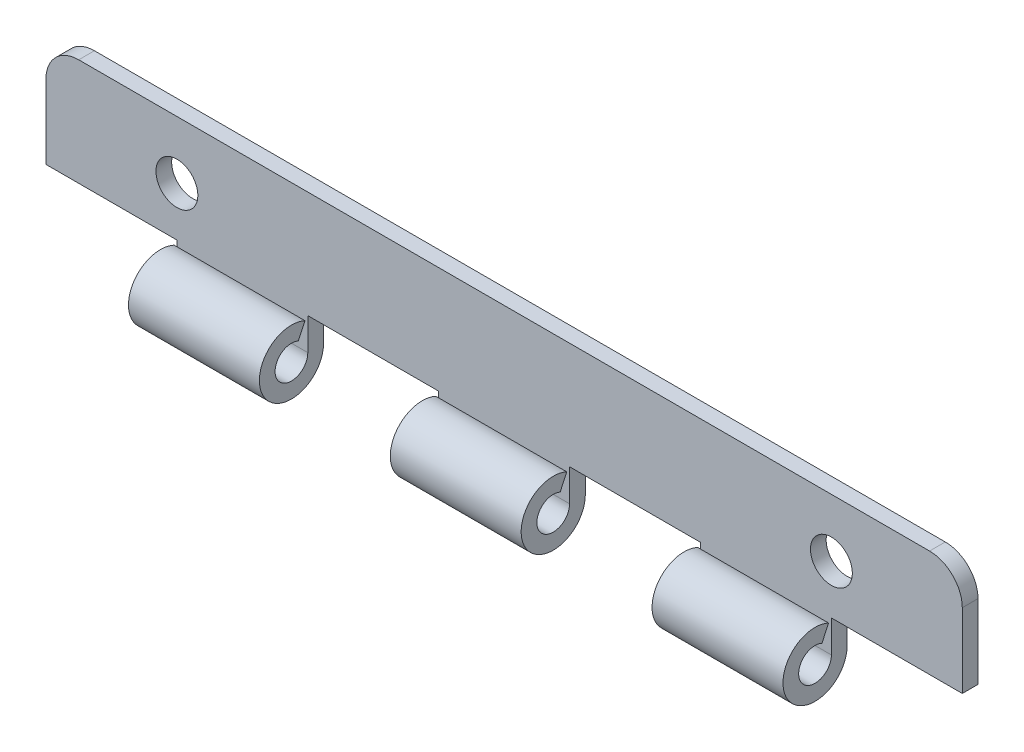
ISO-10303-21;
HEADER;
FILE_DESCRIPTION(('STEP AP214'),'2;1');
FILE_NAME('part.step','',(''),(''),'','','');
FILE_SCHEMA(('AUTOMOTIVE_DESIGN { 1 0 10303 214 1 1 1 1 }'));
ENDSEC;
DATA;
#1=APPLICATION_CONTEXT('core data for automotive mechanical design processes');
#2=APPLICATION_PROTOCOL_DEFINITION('international standard','automotive_design',2000,#1);
#3=PRODUCT_CONTEXT('',#1,'mechanical');
#4=PRODUCT('Part','Part','',(#3));
#5=PRODUCT_RELATED_PRODUCT_CATEGORY('part','',(#4));
#6=PRODUCT_DEFINITION_FORMATION('','',#4);
#7=PRODUCT_DEFINITION_CONTEXT('part definition',#1,'design');
#8=PRODUCT_DEFINITION('design','',#6,#7);
#9=PRODUCT_DEFINITION_SHAPE('','',#8);
#10=(LENGTH_UNIT() NAMED_UNIT(*) SI_UNIT(.MILLI.,.METRE.));
#11=(NAMED_UNIT(*) PLANE_ANGLE_UNIT() SI_UNIT($,.RADIAN.));
#12=(NAMED_UNIT(*) SI_UNIT($,.STERADIAN.) SOLID_ANGLE_UNIT());
#13=UNCERTAINTY_MEASURE_WITH_UNIT(LENGTH_MEASURE(1.E-05),#10,'distance_accuracy_value','');
#14=(GEOMETRIC_REPRESENTATION_CONTEXT(3) GLOBAL_UNCERTAINTY_ASSIGNED_CONTEXT((#13)) GLOBAL_UNIT_ASSIGNED_CONTEXT((#10,
#11,#12)) REPRESENTATION_CONTEXT('',''));
#15=CARTESIAN_POINT('',(0.,0.,0.));
#16=DIRECTION('',(0.,0.,1.));
#17=DIRECTION('',(1.,0.,0.));
#18=AXIS2_PLACEMENT_3D('',#15,#16,#17);
#19=CARTESIAN_POINT('',(-304.8,0.,0.));
#20=DIRECTION('',(1.,0.,0.));
#21=DIRECTION('',(0.,0.,-1.));
#22=AXIS2_PLACEMENT_3D('',#19,#20,#21);
#23=CYLINDRICAL_SURFACE('',#22,1.5875);
#24=CARTESIAN_POINT('',(-228.6,0.,0.));
#25=DIRECTION('',(-1.,0.,0.));
#26=DIRECTION('',(0.,0.,1.));
#27=AXIS2_PLACEMENT_3D('',#24,#25,#26);
#28=CIRCLE('',#27,1.5875);
#29=CARTESIAN_POINT('',(-228.6,0.,-1.5875));
#30=VERTEX_POINT('',#29);
#31=CARTESIAN_POINT('',(-228.6,1.43876361192068,-0.670906490513362));
#32=VERTEX_POINT('',#31);
#33=EDGE_CURVE('E422',#30,#32,#28,.T.);
#34=ORIENTED_EDGE('',*,*,#33,.F.);
#35=DIRECTION('',(1.,0.,0.));
#36=VECTOR('',#35,1.);
#37=CARTESIAN_POINT('',(-304.8,0.,-1.5875));
#38=LINE('',#37,#36);
#39=CARTESIAN_POINT('',(-241.3,0.,-1.5875));
#40=VERTEX_POINT('',#39);
#41=EDGE_CURVE('E439',#40,#30,#38,.T.);
#42=ORIENTED_EDGE('',*,*,#41,.F.);
#43=CARTESIAN_POINT('',(-241.3,0.,0.));
#44=DIRECTION('',(1.,0.,0.));
#45=DIRECTION('',(0.,0.,-1.));
#46=AXIS2_PLACEMENT_3D('',#43,#44,#45);
#47=CIRCLE('',#46,1.5875);
#48=CARTESIAN_POINT('',(-241.3,1.43876361192068,-0.670906490513362));
#49=VERTEX_POINT('',#48);
#50=EDGE_CURVE('E391',#49,#40,#47,.T.);
#51=ORIENTED_EDGE('',*,*,#50,.F.);
#52=DIRECTION('',(1.,0.,0.));
#53=VECTOR('',#52,1.);
#54=CARTESIAN_POINT('',(-304.8,1.43876361192068,-0.670906490513362));
#55=LINE('',#54,#53);
#56=EDGE_CURVE('E438',#49,#32,#55,.T.);
#57=ORIENTED_EDGE('',*,*,#56,.T.);
#58=EDGE_LOOP('',(#34,#42,#51,#57));
#59=FACE_BOUND('',#58,.T.);
#60=ADVANCED_FACE('F51',(#59),#23,.F.);
#61=CARTESIAN_POINT('',(-254.,0.,0.));
#62=DIRECTION('',(-1.,0.,0.));
#63=DIRECTION('',(0.,0.,1.));
#64=AXIS2_PLACEMENT_3D('',#61,#62,#63);
#65=CIRCLE('',#64,1.5875);
#66=CARTESIAN_POINT('',(-254.,0.,-1.5875));
#67=VERTEX_POINT('',#66);
#68=CARTESIAN_POINT('',(-254.,1.43876361192068,-0.670906490513362));
#69=VERTEX_POINT('',#68);
#70=EDGE_CURVE('E406',#67,#69,#65,.T.);
#71=ORIENTED_EDGE('',*,*,#70,.F.);
#72=CARTESIAN_POINT('',(-266.7,0.,-1.5875));
#73=VERTEX_POINT('',#72);
#74=EDGE_CURVE('E443',#73,#67,#38,.T.);
#75=ORIENTED_EDGE('',*,*,#74,.F.);
#76=CARTESIAN_POINT('',(-266.7,0.,0.));
#77=DIRECTION('',(1.,0.,0.));
#78=DIRECTION('',(0.,0.,-1.));
#79=AXIS2_PLACEMENT_3D('',#76,#77,#78);
#80=CIRCLE('',#79,1.5875);
#81=CARTESIAN_POINT('',(-266.7,1.43876361192068,-0.670906490513362));
#82=VERTEX_POINT('',#81);
#83=EDGE_CURVE('E363',#82,#73,#80,.T.);
#84=ORIENTED_EDGE('',*,*,#83,.F.);
#85=EDGE_CURVE('E468',#82,#69,#55,.T.);
#86=ORIENTED_EDGE('',*,*,#85,.T.);
#87=EDGE_LOOP('',(#71,#75,#84,#86));
#88=FACE_BOUND('',#87,.T.);
#89=ADVANCED_FACE('F545',(#88),#23,.F.);
#90=CARTESIAN_POINT('',(-279.4,0.,0.));
#91=DIRECTION('',(-1.,0.,0.));
#92=DIRECTION('',(0.,0.,1.));
#93=AXIS2_PLACEMENT_3D('',#90,#91,#92);
#94=CIRCLE('',#93,1.5875);
#95=CARTESIAN_POINT('',(-279.4,0.,-1.5875));
#96=VERTEX_POINT('',#95);
#97=CARTESIAN_POINT('',(-279.4,1.43876361192068,-0.670906490513362));
#98=VERTEX_POINT('',#97);
#99=EDGE_CURVE('E378',#96,#98,#94,.T.);
#100=ORIENTED_EDGE('',*,*,#99,.F.);
#101=CARTESIAN_POINT('',(-292.1,0.,-1.5875));
#102=VERTEX_POINT('',#101);
#103=EDGE_CURVE('E445',#102,#96,#38,.T.);
#104=ORIENTED_EDGE('',*,*,#103,.F.);
#105=CARTESIAN_POINT('',(-292.1,0.,0.));
#106=DIRECTION('',(1.,0.,0.));
#107=DIRECTION('',(0.,0.,-1.));
#108=AXIS2_PLACEMENT_3D('',#105,#106,#107);
#109=CIRCLE('',#108,1.5875);
#110=CARTESIAN_POINT('',(-292.1,1.43876361192068,-0.670906490513362));
#111=VERTEX_POINT('',#110);
#112=EDGE_CURVE('E351',#111,#102,#109,.T.);
#113=ORIENTED_EDGE('',*,*,#112,.F.);
#114=EDGE_CURVE('E464',#111,#98,#55,.T.);
#115=ORIENTED_EDGE('',*,*,#114,.T.);
#116=EDGE_LOOP('',(#100,#104,#113,#115));
#117=FACE_BOUND('',#116,.T.);
#118=ADVANCED_FACE('F559',(#117),#23,.F.);
#119=CARTESIAN_POINT('',(-304.8,0.,0.));
#120=DIRECTION('',(1.,0.,0.));
#121=DIRECTION('',(0.,0.,-1.));
#122=AXIS2_PLACEMENT_3D('',#119,#120,#121);
#123=CYLINDRICAL_SURFACE('',#122,3.1115);
#124=CARTESIAN_POINT('',(-228.6,0.,0.));
#125=DIRECTION('',(-1.,0.,0.));
#126=DIRECTION('',(0.,0.,1.));
#127=AXIS2_PLACEMENT_3D('',#124,#125,#126);
#128=CIRCLE('',#127,3.1115);
#129=CARTESIAN_POINT('',(-228.6,2.81997667936453,-1.31497672140619));
#130=VERTEX_POINT('',#129);
#131=CARTESIAN_POINT('',(-228.6,0.,-3.1115));
#132=VERTEX_POINT('',#131);
#133=EDGE_CURVE('E429',#130,#132,#128,.F.);
#134=ORIENTED_EDGE('',*,*,#133,.F.);
#135=DIRECTION('',(1.,0.,0.));
#136=VECTOR('',#135,1.);
#137=CARTESIAN_POINT('',(-304.8,2.81997667936453,-1.31497672140619));
#138=LINE('',#137,#136);
#139=CARTESIAN_POINT('',(-241.3,2.81997667936453,-1.31497672140619));
#140=VERTEX_POINT('',#139);
#141=EDGE_CURVE('E459',#140,#130,#138,.T.);
#142=ORIENTED_EDGE('',*,*,#141,.F.);
#143=CARTESIAN_POINT('',(-241.3,0.,0.));
#144=DIRECTION('',(1.,0.,0.));
#145=DIRECTION('',(0.,0.,-1.));
#146=AXIS2_PLACEMENT_3D('',#143,#144,#145);
#147=CIRCLE('',#146,3.1115);
#148=CARTESIAN_POINT('',(-241.3,0.,-3.1115));
#149=VERTEX_POINT('',#148);
#150=EDGE_CURVE('E397',#149,#140,#147,.F.);
#151=ORIENTED_EDGE('',*,*,#150,.F.);
#152=DIRECTION('',(1.,0.,0.));
#153=VECTOR('',#152,1.);
#154=CARTESIAN_POINT('',(-304.8,0.,-3.1115));
#155=LINE('',#154,#153);
#156=EDGE_CURVE('E453',#149,#132,#155,.T.);
#157=ORIENTED_EDGE('',*,*,#156,.T.);
#158=EDGE_LOOP('',(#134,#142,#151,#157));
#159=FACE_BOUND('',#158,.T.);
#160=ADVANCED_FACE('F605',(#159),#123,.T.);
#161=CARTESIAN_POINT('',(-254.,0.,0.));
#162=DIRECTION('',(-1.,0.,0.));
#163=DIRECTION('',(0.,0.,1.));
#164=AXIS2_PLACEMENT_3D('',#161,#162,#163);
#165=CIRCLE('',#164,3.1115);
#166=CARTESIAN_POINT('',(-254.,2.81997667936453,-1.31497672140619));
#167=VERTEX_POINT('',#166);
#168=CARTESIAN_POINT('',(-254.,0.,-3.1115));
#169=VERTEX_POINT('',#168);
#170=EDGE_CURVE('E413',#167,#169,#165,.F.);
#171=ORIENTED_EDGE('',*,*,#170,.F.);
#172=CARTESIAN_POINT('',(-266.7,2.81997667936453,-1.31497672140619));
#173=VERTEX_POINT('',#172);
#174=EDGE_CURVE('E463',#173,#167,#138,.T.);
#175=ORIENTED_EDGE('',*,*,#174,.F.);
#176=CARTESIAN_POINT('',(-266.7,0.,0.));
#177=DIRECTION('',(1.,0.,0.));
#178=DIRECTION('',(0.,0.,-1.));
#179=AXIS2_PLACEMENT_3D('',#176,#177,#178);
#180=CIRCLE('',#179,3.1115);
#181=CARTESIAN_POINT('',(-266.7,0.,-3.1115));
#182=VERTEX_POINT('',#181);
#183=EDGE_CURVE('E369',#182,#173,#180,.F.);
#184=ORIENTED_EDGE('',*,*,#183,.F.);
#185=EDGE_CURVE('E457',#182,#169,#155,.T.);
#186=ORIENTED_EDGE('',*,*,#185,.T.);
#187=EDGE_LOOP('',(#171,#175,#184,#186));
#188=FACE_BOUND('',#187,.T.);
#189=ADVANCED_FACE('F534',(#188),#123,.T.);
#190=CARTESIAN_POINT('',(-279.4,0.,0.));
#191=DIRECTION('',(-1.,0.,0.));
#192=DIRECTION('',(0.,0.,1.));
#193=AXIS2_PLACEMENT_3D('',#190,#191,#192);
#194=CIRCLE('',#193,3.1115);
#195=CARTESIAN_POINT('',(-279.4,2.81997667936453,-1.31497672140619));
#196=VERTEX_POINT('',#195);
#197=CARTESIAN_POINT('',(-279.4,0.,-3.1115));
#198=VERTEX_POINT('',#197);
#199=EDGE_CURVE('E385',#196,#198,#194,.F.);
#200=ORIENTED_EDGE('',*,*,#199,.F.);
#201=CARTESIAN_POINT('',(-292.1,2.81997667936453,-1.31497672140619));
#202=VERTEX_POINT('',#201);
#203=EDGE_CURVE('E458',#202,#196,#138,.T.);
#204=ORIENTED_EDGE('',*,*,#203,.F.);
#205=CARTESIAN_POINT('',(-292.1,0.,0.));
#206=DIRECTION('',(1.,0.,0.));
#207=DIRECTION('',(0.,0.,-1.));
#208=AXIS2_PLACEMENT_3D('',#205,#206,#207);
#209=CIRCLE('',#208,3.1115);
#210=CARTESIAN_POINT('',(-292.1,0.,-3.1115));
#211=VERTEX_POINT('',#210);
#212=EDGE_CURVE('E357',#211,#202,#209,.F.);
#213=ORIENTED_EDGE('',*,*,#212,.F.);
#214=EDGE_CURVE('E452',#211,#198,#155,.T.);
#215=ORIENTED_EDGE('',*,*,#214,.T.);
#216=EDGE_LOOP('',(#200,#204,#213,#215));
#217=FACE_BOUND('',#216,.T.);
#218=ADVANCED_FACE('F517',(#217),#123,.T.);
#219=CARTESIAN_POINT('',(-304.8,1.43876361192068,-0.670906490513362));
#220=DIRECTION('',(0.,-0.4226182617407,-0.90630778703665));
#221=DIRECTION('',(0.,0.90630778703665,-0.4226182617407));
#222=AXIS2_PLACEMENT_3D('',#219,#220,#221);
#223=PLANE('',#222);
#224=DIRECTION('',(0.,0.90630778703665,-0.4226182617407));
#225=VECTOR('',#224,1.);
#226=CARTESIAN_POINT('',(-228.6,1.43876361192068,-0.670906490513362));
#227=LINE('',#226,#225);
#228=EDGE_CURVE('E425',#32,#130,#227,.T.);
#229=ORIENTED_EDGE('',*,*,#228,.F.);
#230=ORIENTED_EDGE('',*,*,#56,.F.);
#231=DIRECTION('',(0.,-0.90630778703665,0.4226182617407));
#232=VECTOR('',#231,1.);
#233=CARTESIAN_POINT('',(-241.3,1.43876361192068,-0.670906490513362));
#234=LINE('',#233,#232);
#235=EDGE_CURVE('E394',#140,#49,#234,.T.);
#236=ORIENTED_EDGE('',*,*,#235,.F.);
#237=ORIENTED_EDGE('',*,*,#141,.T.);
#238=EDGE_LOOP('',(#229,#230,#236,#237));
#239=FACE_BOUND('',#238,.T.);
#240=ADVANCED_FACE('F613',(#239),#223,.T.);
#241=DIRECTION('',(0.,0.90630778703665,-0.4226182617407));
#242=VECTOR('',#241,1.);
#243=CARTESIAN_POINT('',(-254.,1.43876361192068,-0.670906490513362));
#244=LINE('',#243,#242);
#245=EDGE_CURVE('E409',#69,#167,#244,.T.);
#246=ORIENTED_EDGE('',*,*,#245,.F.);
#247=ORIENTED_EDGE('',*,*,#85,.F.);
#248=DIRECTION('',(0.,-0.90630778703665,0.4226182617407));
#249=VECTOR('',#248,1.);
#250=CARTESIAN_POINT('',(-266.7,1.43876361192068,-0.670906490513362));
#251=LINE('',#250,#249);
#252=EDGE_CURVE('E366',#173,#82,#251,.T.);
#253=ORIENTED_EDGE('',*,*,#252,.F.);
#254=ORIENTED_EDGE('',*,*,#174,.T.);
#255=EDGE_LOOP('',(#246,#247,#253,#254));
#256=FACE_BOUND('',#255,.T.);
#257=ADVANCED_FACE('F529',(#256),#223,.T.);
#258=DIRECTION('',(0.,0.90630778703665,-0.4226182617407));
#259=VECTOR('',#258,1.);
#260=CARTESIAN_POINT('',(-279.4,1.43876361192068,-0.670906490513362));
#261=LINE('',#260,#259);
#262=EDGE_CURVE('E381',#98,#196,#261,.T.);
#263=ORIENTED_EDGE('',*,*,#262,.F.);
#264=ORIENTED_EDGE('',*,*,#114,.F.);
#265=DIRECTION('',(0.,-0.90630778703665,0.4226182617407));
#266=VECTOR('',#265,1.);
#267=CARTESIAN_POINT('',(-292.1,1.43876361192068,-0.670906490513362));
#268=LINE('',#267,#266);
#269=EDGE_CURVE('E354',#202,#111,#268,.T.);
#270=ORIENTED_EDGE('',*,*,#269,.F.);
#271=ORIENTED_EDGE('',*,*,#203,.T.);
#272=EDGE_LOOP('',(#263,#264,#270,#271));
#273=FACE_BOUND('',#272,.T.);
#274=ADVANCED_FACE('F564',(#273),#223,.T.);
#275=CARTESIAN_POINT('',(-304.8,2.67605605322459,-1.58750000000001));
#276=DIRECTION('',(0.,0.,1.));
#277=DIRECTION('',(0.,-1.,0.));
#278=AXIS2_PLACEMENT_3D('',#275,#276,#277);
#279=PLANE('',#278);
#280=CARTESIAN_POINT('',(-228.600000001836,7.87400000185669,-1.58750000000002));
#281=DIRECTION('',(0.,0.,1.));
#282=DIRECTION('',(0.,-1.,0.));
#283=AXIS2_PLACEMENT_3D('',#280,#281,#282);
#284=CIRCLE('',#283,2.03200000000001);
#285=CARTESIAN_POINT('',(-228.600000001836,5.84200000185669,-1.58750000000001));
#286=VERTEX_POINT('',#285);
#287=EDGE_CURVE('E282',#286,#286,#284,.T.);
#288=ORIENTED_EDGE('',*,*,#287,.F.);
#289=EDGE_LOOP('',(#288));
#290=FACE_BOUND('',#289,.T.);
#291=CARTESIAN_POINT('',(-292.100000001836,7.87400000185665,-1.58750000000002));
#292=DIRECTION('',(0.,0.,1.));
#293=DIRECTION('',(0.,-1.,0.));
#294=AXIS2_PLACEMENT_3D('',#291,#292,#293);
#295=CIRCLE('',#294,2.03199999770154);
#296=CARTESIAN_POINT('',(-292.100000001836,5.84200000415512,-1.58750000000001));
#297=VERTEX_POINT('',#296);
#298=EDGE_CURVE('E567',#297,#297,#295,.T.);
#299=ORIENTED_EDGE('',*,*,#298,.F.);
#300=EDGE_LOOP('',(#299));
#301=FACE_BOUND('',#300,.T.);
#302=DIRECTION('',(1.,0.,0.));
#303=VECTOR('',#302,1.);
#304=CARTESIAN_POINT('',(-304.8,13.49375,-1.5875));
#305=LINE('',#304,#303);
#306=CARTESIAN_POINT('',(-301.625,13.49375,-1.5875));
#307=VERTEX_POINT('',#306);
#308=CARTESIAN_POINT('',(-219.075,13.49375,-1.5875));
#309=VERTEX_POINT('',#308);
#310=EDGE_CURVE('E444',#307,#309,#305,.T.);
#311=ORIENTED_EDGE('',*,*,#310,.F.);
#312=CARTESIAN_POINT('',(-301.625,10.31875,-1.58750000000002));
#313=DIRECTION('',(0.,0.,1.));
#314=DIRECTION('',(0.,-1.,0.));
#315=AXIS2_PLACEMENT_3D('',#312,#313,#314);
#316=CIRCLE('',#315,3.175);
#317=CARTESIAN_POINT('',(-304.8,10.31875,-1.5875));
#318=VERTEX_POINT('',#317);
#319=EDGE_CURVE('E485',#307,#318,#316,.T.);
#320=ORIENTED_EDGE('',*,*,#319,.T.);
#321=DIRECTION('',(0.,-1.,0.));
#322=VECTOR('',#321,1.);
#323=CARTESIAN_POINT('',(-304.8,13.49375,-1.5875));
#324=LINE('',#323,#322);
#325=CARTESIAN_POINT('',(-304.8,3.11150000000004,-1.58750000000001));
#326=VERTEX_POINT('',#325);
#327=EDGE_CURVE('E435',#318,#326,#324,.T.);
#328=ORIENTED_EDGE('',*,*,#327,.T.);
#329=DIRECTION('',(-1.,0.,0.));
#330=VECTOR('',#329,1.);
#331=CARTESIAN_POINT('',(-304.8,3.11150000000004,-1.58750000000001));
#332=LINE('',#331,#330);
#333=CARTESIAN_POINT('',(-292.1,3.11150000000004,-1.5875));
#334=VERTEX_POINT('',#333);
#335=EDGE_CURVE('E300',#334,#326,#332,.T.);
#336=ORIENTED_EDGE('',*,*,#335,.F.);
#337=DIRECTION('',(0.,1.,0.));
#338=VECTOR('',#337,1.);
#339=CARTESIAN_POINT('',(-292.1,2.67605605322459,-1.58750000000001));
#340=LINE('',#339,#338);
#341=EDGE_CURVE('E348',#102,#334,#340,.T.);
#342=ORIENTED_EDGE('',*,*,#341,.F.);
#343=ORIENTED_EDGE('',*,*,#103,.T.);
#344=DIRECTION('',(0.,-1.,0.));
#345=VECTOR('',#344,1.);
#346=CARTESIAN_POINT('',(-279.4,2.67605605322459,-1.58750000000001));
#347=LINE('',#346,#345);
#348=CARTESIAN_POINT('',(-279.4,3.11150000000004,-1.58750000000001));
#349=VERTEX_POINT('',#348);
#350=EDGE_CURVE('E375',#349,#96,#347,.T.);
#351=ORIENTED_EDGE('',*,*,#350,.F.);
#352=DIRECTION('',(-1.,0.,0.));
#353=VECTOR('',#352,1.);
#354=CARTESIAN_POINT('',(-304.8,3.11150000000003,-1.58750000000001));
#355=LINE('',#354,#353);
#356=CARTESIAN_POINT('',(-266.7,3.11150000000004,-1.5875));
#357=VERTEX_POINT('',#356);
#358=EDGE_CURVE('E372',#357,#349,#355,.T.);
#359=ORIENTED_EDGE('',*,*,#358,.F.);
#360=DIRECTION('',(0.,1.,0.));
#361=VECTOR('',#360,1.);
#362=CARTESIAN_POINT('',(-266.7,2.67605605322459,-1.58750000000001));
#363=LINE('',#362,#361);
#364=EDGE_CURVE('E360',#73,#357,#363,.T.);
#365=ORIENTED_EDGE('',*,*,#364,.F.);
#366=ORIENTED_EDGE('',*,*,#74,.T.);
#367=DIRECTION('',(0.,-1.,0.));
#368=VECTOR('',#367,1.);
#369=CARTESIAN_POINT('',(-254.,2.67605605322459,-1.58750000000001));
#370=LINE('',#369,#368);
#371=CARTESIAN_POINT('',(-254.,3.11150000000004,-1.58750000000001));
#372=VERTEX_POINT('',#371);
#373=EDGE_CURVE('E403',#372,#67,#370,.T.);
#374=ORIENTED_EDGE('',*,*,#373,.F.);
#375=DIRECTION('',(-1.,0.,0.));
#376=VECTOR('',#375,1.);
#377=CARTESIAN_POINT('',(-304.8,3.11150000000003,-1.58750000000001));
#378=LINE('',#377,#376);
#379=CARTESIAN_POINT('',(-241.3,3.11150000000004,-1.5875));
#380=VERTEX_POINT('',#379);
#381=EDGE_CURVE('E400',#380,#372,#378,.T.);
#382=ORIENTED_EDGE('',*,*,#381,.F.);
#383=DIRECTION('',(0.,1.,0.));
#384=VECTOR('',#383,1.);
#385=CARTESIAN_POINT('',(-241.3,2.67605605322459,-1.58750000000001));
#386=LINE('',#385,#384);
#387=EDGE_CURVE('E388',#40,#380,#386,.T.);
#388=ORIENTED_EDGE('',*,*,#387,.F.);
#389=ORIENTED_EDGE('',*,*,#41,.T.);
#390=DIRECTION('',(0.,-1.,0.));
#391=VECTOR('',#390,1.);
#392=CARTESIAN_POINT('',(-228.6,2.67605605322459,-1.58750000000001));
#393=LINE('',#392,#391);
#394=CARTESIAN_POINT('',(-228.6,3.11150000000004,-1.58750000000001));
#395=VERTEX_POINT('',#394);
#396=EDGE_CURVE('E419',#395,#30,#393,.T.);
#397=ORIENTED_EDGE('',*,*,#396,.F.);
#398=DIRECTION('',(-1.,0.,0.));
#399=VECTOR('',#398,1.);
#400=CARTESIAN_POINT('',(-304.8,3.11150000000003,-1.58750000000001));
#401=LINE('',#400,#399);
#402=CARTESIAN_POINT('',(-215.9,3.11150000000004,-1.5875));
#403=VERTEX_POINT('',#402);
#404=EDGE_CURVE('E416',#403,#395,#401,.T.);
#405=ORIENTED_EDGE('',*,*,#404,.F.);
#406=DIRECTION('',(0.,-1.,0.));
#407=VECTOR('',#406,1.);
#408=CARTESIAN_POINT('',(-215.9,2.67605605322459,-1.58750000000001));
#409=LINE('',#408,#407);
#410=CARTESIAN_POINT('',(-215.9,10.31875,-1.58750000000002));
#411=VERTEX_POINT('',#410);
#412=EDGE_CURVE('E269',#411,#403,#409,.T.);
#413=ORIENTED_EDGE('',*,*,#412,.F.);
#414=CARTESIAN_POINT('',(-219.075,10.31875,-1.58750000000002));
#415=DIRECTION('',(0.,0.,1.));
#416=DIRECTION('',(0.,-1.,0.));
#417=AXIS2_PLACEMENT_3D('',#414,#415,#416);
#418=CIRCLE('',#417,3.175);
#419=EDGE_CURVE('E482',#411,#309,#418,.T.);
#420=ORIENTED_EDGE('',*,*,#419,.T.);
#421=EDGE_LOOP('',(#311,#320,#328,#336,#342,#343,#351,#359,#365,#366,#374,#382,#388,#389,#397,
#405,#413,#420));
#422=FACE_BOUND('',#421,.T.);
#423=ADVANCED_FACE('F503',(#290,#301,#422),#279,.T.);
#424=CARTESIAN_POINT('',(-304.8,13.49375,-3.1115));
#425=DIRECTION('',(0.,1.,0.));
#426=DIRECTION('',(0.,0.,1.));
#427=AXIS2_PLACEMENT_3D('',#424,#425,#426);
#428=PLANE('',#427);
#429=DIRECTION('',(1.,0.,0.));
#430=VECTOR('',#429,1.);
#431=CARTESIAN_POINT('',(-304.8,13.49375,-3.1115));
#432=LINE('',#431,#430);
#433=CARTESIAN_POINT('',(-301.625,13.49375,-3.1115));
#434=VERTEX_POINT('',#433);
#435=CARTESIAN_POINT('',(-219.075,13.49375,-3.1115));
#436=VERTEX_POINT('',#435);
#437=EDGE_CURVE('E449',#434,#436,#432,.T.);
#438=ORIENTED_EDGE('',*,*,#437,.F.);
#439=DIRECTION('',(0.,0.,1.));
#440=VECTOR('',#439,1.);
#441=CARTESIAN_POINT('',(-301.625,13.49375,-1.5875));
#442=LINE('',#441,#440);
#443=EDGE_CURVE('E478',#434,#307,#442,.T.);
#444=ORIENTED_EDGE('',*,*,#443,.T.);
#445=ORIENTED_EDGE('',*,*,#310,.T.);
#446=DIRECTION('',(0.,0.,1.));
#447=VECTOR('',#446,1.);
#448=CARTESIAN_POINT('',(-219.075,13.49375,-3.1115));
#449=LINE('',#448,#447);
#450=EDGE_CURVE('E475',#309,#436,#449,.F.);
#451=ORIENTED_EDGE('',*,*,#450,.T.);
#452=EDGE_LOOP('',(#438,#444,#445,#451));
#453=FACE_BOUND('',#452,.T.);
#454=ADVANCED_FACE('F498',(#453),#428,.T.);
#455=CARTESIAN_POINT('',(-304.8,0.,-3.1115));
#456=DIRECTION('',(0.,0.,-1.));
#457=DIRECTION('',(0.,1.,0.));
#458=AXIS2_PLACEMENT_3D('',#455,#456,#457);
#459=PLANE('',#458);
#460=CARTESIAN_POINT('',(-228.600000001836,7.87400000185669,-3.1115));
#461=DIRECTION('',(0.,0.,-1.));
#462=DIRECTION('',(0.,1.,0.));
#463=AXIS2_PLACEMENT_3D('',#460,#461,#462);
#464=CIRCLE('',#463,2.03200000000001);
#465=CARTESIAN_POINT('',(-228.600000001836,9.9060000018567,-3.1115));
#466=VERTEX_POINT('',#465);
#467=EDGE_CURVE('E569',#466,#466,#464,.T.);
#468=ORIENTED_EDGE('',*,*,#467,.F.);
#469=EDGE_LOOP('',(#468));
#470=FACE_BOUND('',#469,.T.);
#471=CARTESIAN_POINT('',(-292.100000001836,7.87400000185665,-3.1115));
#472=DIRECTION('',(0.,0.,-1.));
#473=DIRECTION('',(0.,1.,0.));
#474=AXIS2_PLACEMENT_3D('',#471,#472,#473);
#475=CIRCLE('',#474,2.03199999770154);
#476=CARTESIAN_POINT('',(-292.100000001836,9.90599999955819,-3.1115));
#477=VERTEX_POINT('',#476);
#478=EDGE_CURVE('E577',#477,#477,#475,.T.);
#479=ORIENTED_EDGE('',*,*,#478,.F.);
#480=EDGE_LOOP('',(#479));
#481=FACE_BOUND('',#480,.T.);
#482=DIRECTION('',(0.,1.,0.));
#483=VECTOR('',#482,1.);
#484=CARTESIAN_POINT('',(-304.8,0.,-3.1115));
#485=LINE('',#484,#483);
#486=CARTESIAN_POINT('',(-304.8,3.11150000000004,-3.1115));
#487=VERTEX_POINT('',#486);
#488=CARTESIAN_POINT('',(-304.8,10.31875,-3.1115));
#489=VERTEX_POINT('',#488);
#490=EDGE_CURVE('E432',#487,#489,#485,.T.);
#491=ORIENTED_EDGE('',*,*,#490,.T.);
#492=CARTESIAN_POINT('',(-301.625,10.31875,-3.1115));
#493=DIRECTION('',(0.,0.,-1.));
#494=DIRECTION('',(0.,1.,0.));
#495=AXIS2_PLACEMENT_3D('',#492,#493,#494);
#496=CIRCLE('',#495,3.175);
#497=EDGE_CURVE('E60',#489,#434,#496,.T.);
#498=ORIENTED_EDGE('',*,*,#497,.T.);
#499=ORIENTED_EDGE('',*,*,#437,.T.);
#500=CARTESIAN_POINT('',(-219.075,10.31875,-3.1115));
#501=DIRECTION('',(0.,0.,-1.));
#502=DIRECTION('',(0.,1.,0.));
#503=AXIS2_PLACEMENT_3D('',#500,#501,#502);
#504=CIRCLE('',#503,3.175);
#505=CARTESIAN_POINT('',(-215.9,10.31875,-3.1115));
#506=VERTEX_POINT('',#505);
#507=EDGE_CURVE('E70',#436,#506,#504,.T.);
#508=ORIENTED_EDGE('',*,*,#507,.T.);
#509=DIRECTION('',(0.,1.,0.));
#510=VECTOR('',#509,1.);
#511=CARTESIAN_POINT('',(-215.9,0.,-3.1115));
#512=LINE('',#511,#510);
#513=CARTESIAN_POINT('',(-215.9,3.11150000000004,-3.1115));
#514=VERTEX_POINT('',#513);
#515=EDGE_CURVE('E266',#514,#506,#512,.T.);
#516=ORIENTED_EDGE('',*,*,#515,.F.);
#517=DIRECTION('',(-1.,0.,0.));
#518=VECTOR('',#517,1.);
#519=CARTESIAN_POINT('',(-228.6,3.11150000000004,-3.1115));
#520=LINE('',#519,#518);
#521=CARTESIAN_POINT('',(-228.6,3.11150000000004,-3.1115));
#522=VERTEX_POINT('',#521);
#523=EDGE_CURVE('E280',#514,#522,#520,.T.);
#524=ORIENTED_EDGE('',*,*,#523,.T.);
#525=DIRECTION('',(0.,-1.,0.));
#526=VECTOR('',#525,1.);
#527=CARTESIAN_POINT('',(-228.6,-3.1115,-3.1115));
#528=LINE('',#527,#526);
#529=EDGE_CURVE('E275',#522,#132,#528,.T.);
#530=ORIENTED_EDGE('',*,*,#529,.T.);
#531=ORIENTED_EDGE('',*,*,#156,.F.);
#532=DIRECTION('',(0.,-1.,0.));
#533=VECTOR('',#532,1.);
#534=CARTESIAN_POINT('',(-241.3,0.,-3.1115));
#535=LINE('',#534,#533);
#536=CARTESIAN_POINT('',(-241.3,3.11150000000004,-3.1115));
#537=VERTEX_POINT('',#536);
#538=EDGE_CURVE('E472',#537,#149,#535,.T.);
#539=ORIENTED_EDGE('',*,*,#538,.F.);
#540=DIRECTION('',(-1.,0.,0.));
#541=VECTOR('',#540,1.);
#542=CARTESIAN_POINT('',(-254.,3.11150000000004,-3.1115));
#543=LINE('',#542,#541);
#544=CARTESIAN_POINT('',(-254.,3.11150000000004,-3.1115));
#545=VERTEX_POINT('',#544);
#546=EDGE_CURVE('E302',#537,#545,#543,.T.);
#547=ORIENTED_EDGE('',*,*,#546,.T.);
#548=DIRECTION('',(0.,-1.,0.));
#549=VECTOR('',#548,1.);
#550=CARTESIAN_POINT('',(-254.,-3.1115,-3.1115));
#551=LINE('',#550,#549);
#552=EDGE_CURVE('E306',#545,#169,#551,.T.);
#553=ORIENTED_EDGE('',*,*,#552,.T.);
#554=ORIENTED_EDGE('',*,*,#185,.F.);
#555=DIRECTION('',(0.,-1.,0.));
#556=VECTOR('',#555,1.);
#557=CARTESIAN_POINT('',(-266.7,0.,-3.1115));
#558=LINE('',#557,#556);
#559=CARTESIAN_POINT('',(-266.7,3.11150000000004,-3.1115));
#560=VERTEX_POINT('',#559);
#561=EDGE_CURVE('E469',#560,#182,#558,.T.);
#562=ORIENTED_EDGE('',*,*,#561,.F.);
#563=DIRECTION('',(-1.,0.,0.));
#564=VECTOR('',#563,1.);
#565=CARTESIAN_POINT('',(-279.4,3.11150000000004,-3.1115));
#566=LINE('',#565,#564);
#567=CARTESIAN_POINT('',(-279.4,3.11150000000004,-3.1115));
#568=VERTEX_POINT('',#567);
#569=EDGE_CURVE('E314',#560,#568,#566,.T.);
#570=ORIENTED_EDGE('',*,*,#569,.T.);
#571=DIRECTION('',(0.,-1.,0.));
#572=VECTOR('',#571,1.);
#573=CARTESIAN_POINT('',(-279.4,-3.1115,-3.1115));
#574=LINE('',#573,#572);
#575=EDGE_CURVE('E318',#568,#198,#574,.T.);
#576=ORIENTED_EDGE('',*,*,#575,.T.);
#577=ORIENTED_EDGE('',*,*,#214,.F.);
#578=DIRECTION('',(0.,1.,0.));
#579=VECTOR('',#578,1.);
#580=CARTESIAN_POINT('',(-292.1,3.11150000000004,-3.1115));
#581=LINE('',#580,#579);
#582=CARTESIAN_POINT('',(-292.1,3.11150000000004,-3.1115));
#583=VERTEX_POINT('',#582);
#584=EDGE_CURVE('E330',#211,#583,#581,.T.);
#585=ORIENTED_EDGE('',*,*,#584,.T.);
#586=DIRECTION('',(-1.,0.,0.));
#587=VECTOR('',#586,1.);
#588=CARTESIAN_POINT('',(-304.8,3.11150000000004,-3.1115));
#589=LINE('',#588,#587);
#590=EDGE_CURVE('E334',#583,#487,#589,.T.);
#591=ORIENTED_EDGE('',*,*,#590,.T.);
#592=EDGE_LOOP('',(#491,#498,#499,#508,#516,#524,#530,#531,#539,#547,#553,#554,#562,#570,#576,
#577,#585,#591));
#593=FACE_BOUND('',#592,.T.);
#594=ADVANCED_FACE('F278',(#470,#481,#593),#459,.T.);
#595=CARTESIAN_POINT('',(-304.8,0.,0.));
#596=DIRECTION('',(1.,0.,0.));
#597=DIRECTION('',(0.,0.,-1.));
#598=AXIS2_PLACEMENT_3D('',#595,#596,#597);
#599=PLANE('',#598);
#600=ORIENTED_EDGE('',*,*,#327,.F.);
#601=DIRECTION('',(0.,0.,1.));
#602=VECTOR('',#601,1.);
#603=CARTESIAN_POINT('',(-304.8,10.31875,-3.1115));
#604=LINE('',#603,#602);
#605=EDGE_CURVE('E81',#318,#489,#604,.F.);
#606=ORIENTED_EDGE('',*,*,#605,.T.);
#607=ORIENTED_EDGE('',*,*,#490,.F.);
#608=DIRECTION('',(0.,0.,1.));
#609=VECTOR('',#608,1.);
#610=CARTESIAN_POINT('',(-304.8,3.11150000000004,-3.1115));
#611=LINE('',#610,#609);
#612=EDGE_CURVE('E319',#487,#326,#611,.T.);
#613=ORIENTED_EDGE('',*,*,#612,.T.);
#614=EDGE_LOOP('',(#600,#606,#607,#613));
#615=FACE_BOUND('',#614,.T.);
#616=ADVANCED_FACE('F505',(#615),#599,.F.);
#617=CARTESIAN_POINT('',(-304.8,3.11150000000004,-3.1115));
#618=DIRECTION('',(0.,1.,0.));
#619=DIRECTION('',(-1.,0.,0.));
#620=AXIS2_PLACEMENT_3D('',#617,#618,#619);
#621=PLANE('',#620);
#622=ORIENTED_EDGE('',*,*,#335,.T.);
#623=ORIENTED_EDGE('',*,*,#612,.F.);
#624=ORIENTED_EDGE('',*,*,#590,.F.);
#625=DIRECTION('',(0.,0.,1.));
#626=VECTOR('',#625,1.);
#627=CARTESIAN_POINT('',(-292.1,3.11150000000004,-3.1115));
#628=LINE('',#627,#626);
#629=EDGE_CURVE('E338',#583,#334,#628,.T.);
#630=ORIENTED_EDGE('',*,*,#629,.T.);
#631=EDGE_LOOP('',(#622,#623,#624,#630));
#632=FACE_BOUND('',#631,.T.);
#633=ADVANCED_FACE('F508',(#632),#621,.F.);
#634=CARTESIAN_POINT('',(-292.1,3.11150000000004,-3.1115));
#635=DIRECTION('',(1.,0.,0.));
#636=DIRECTION('',(0.,0.,-1.));
#637=AXIS2_PLACEMENT_3D('',#634,#635,#636);
#638=PLANE('',#637);
#639=ORIENTED_EDGE('',*,*,#212,.T.);
#640=ORIENTED_EDGE('',*,*,#269,.T.);
#641=ORIENTED_EDGE('',*,*,#112,.T.);
#642=ORIENTED_EDGE('',*,*,#341,.T.);
#643=ORIENTED_EDGE('',*,*,#629,.F.);
#644=ORIENTED_EDGE('',*,*,#584,.F.);
#645=EDGE_LOOP('',(#639,#640,#641,#642,#643,#644));
#646=FACE_BOUND('',#645,.T.);
#647=ADVANCED_FACE('F513',(#646),#638,.F.);
#648=CARTESIAN_POINT('',(-279.4,-3.1115,-3.1115));
#649=DIRECTION('',(-1.,0.,0.));
#650=DIRECTION('',(0.,0.,1.));
#651=AXIS2_PLACEMENT_3D('',#648,#649,#650);
#652=PLANE('',#651);
#653=ORIENTED_EDGE('',*,*,#199,.T.);
#654=ORIENTED_EDGE('',*,*,#575,.F.);
#655=DIRECTION('',(0.,0.,1.));
#656=VECTOR('',#655,1.);
#657=CARTESIAN_POINT('',(-279.4,3.11150000000004,-3.1115));
#658=LINE('',#657,#656);
#659=EDGE_CURVE('E307',#568,#349,#658,.T.);
#660=ORIENTED_EDGE('',*,*,#659,.T.);
#661=ORIENTED_EDGE('',*,*,#350,.T.);
#662=ORIENTED_EDGE('',*,*,#99,.T.);
#663=ORIENTED_EDGE('',*,*,#262,.T.);
#664=EDGE_LOOP('',(#653,#654,#660,#661,#662,#663));
#665=FACE_BOUND('',#664,.T.);
#666=ADVANCED_FACE('F563',(#665),#652,.F.);
#667=CARTESIAN_POINT('',(-279.4,3.11150000000004,-3.1115));
#668=DIRECTION('',(0.,1.,0.));
#669=DIRECTION('',(-1.,0.,0.));
#670=AXIS2_PLACEMENT_3D('',#667,#668,#669);
#671=PLANE('',#670);
#672=ORIENTED_EDGE('',*,*,#358,.T.);
#673=ORIENTED_EDGE('',*,*,#659,.F.);
#674=ORIENTED_EDGE('',*,*,#569,.F.);
#675=DIRECTION('',(0.,0.,1.));
#676=VECTOR('',#675,1.);
#677=CARTESIAN_POINT('',(-266.7,3.11150000000004,-3.1115));
#678=LINE('',#677,#676);
#679=EDGE_CURVE('E323',#560,#357,#678,.T.);
#680=ORIENTED_EDGE('',*,*,#679,.T.);
#681=EDGE_LOOP('',(#672,#673,#674,#680));
#682=FACE_BOUND('',#681,.T.);
#683=ADVANCED_FACE('F637',(#682),#671,.F.);
#684=CARTESIAN_POINT('',(-266.7,3.11150000000004,-3.1115));
#685=DIRECTION('',(1.,0.,0.));
#686=DIRECTION('',(0.,0.,-1.));
#687=AXIS2_PLACEMENT_3D('',#684,#685,#686);
#688=PLANE('',#687);
#689=ORIENTED_EDGE('',*,*,#183,.T.);
#690=ORIENTED_EDGE('',*,*,#252,.T.);
#691=ORIENTED_EDGE('',*,*,#83,.T.);
#692=ORIENTED_EDGE('',*,*,#364,.T.);
#693=ORIENTED_EDGE('',*,*,#679,.F.);
#694=ORIENTED_EDGE('',*,*,#561,.T.);
#695=EDGE_LOOP('',(#689,#690,#691,#692,#693,#694));
#696=FACE_BOUND('',#695,.T.);
#697=ADVANCED_FACE('F634',(#696),#688,.F.);
#698=CARTESIAN_POINT('',(-254.,-3.1115,-3.1115));
#699=DIRECTION('',(-1.,0.,0.));
#700=DIRECTION('',(0.,0.,1.));
#701=AXIS2_PLACEMENT_3D('',#698,#699,#700);
#702=PLANE('',#701);
#703=ORIENTED_EDGE('',*,*,#170,.T.);
#704=ORIENTED_EDGE('',*,*,#552,.F.);
#705=DIRECTION('',(0.,0.,1.));
#706=VECTOR('',#705,1.);
#707=CARTESIAN_POINT('',(-254.,3.11150000000004,-3.1115));
#708=LINE('',#707,#706);
#709=EDGE_CURVE('E288',#545,#372,#708,.T.);
#710=ORIENTED_EDGE('',*,*,#709,.T.);
#711=ORIENTED_EDGE('',*,*,#373,.T.);
#712=ORIENTED_EDGE('',*,*,#70,.T.);
#713=ORIENTED_EDGE('',*,*,#245,.T.);
#714=EDGE_LOOP('',(#703,#704,#710,#711,#712,#713));
#715=FACE_BOUND('',#714,.T.);
#716=ADVANCED_FACE('F539',(#715),#702,.F.);
#717=CARTESIAN_POINT('',(-254.,3.11150000000004,-3.1115));
#718=DIRECTION('',(0.,1.,0.));
#719=DIRECTION('',(-1.,0.,0.));
#720=AXIS2_PLACEMENT_3D('',#717,#718,#719);
#721=PLANE('',#720);
#722=ORIENTED_EDGE('',*,*,#381,.T.);
#723=ORIENTED_EDGE('',*,*,#709,.F.);
#724=ORIENTED_EDGE('',*,*,#546,.F.);
#725=DIRECTION('',(0.,0.,1.));
#726=VECTOR('',#725,1.);
#727=CARTESIAN_POINT('',(-241.3,3.11150000000004,-3.1115));
#728=LINE('',#727,#726);
#729=EDGE_CURVE('E295',#537,#380,#728,.T.);
#730=ORIENTED_EDGE('',*,*,#729,.T.);
#731=EDGE_LOOP('',(#722,#723,#724,#730));
#732=FACE_BOUND('',#731,.T.);
#733=ADVANCED_FACE('F648',(#732),#721,.F.);
#734=CARTESIAN_POINT('',(-241.3,3.11150000000004,-3.1115));
#735=DIRECTION('',(1.,0.,0.));
#736=DIRECTION('',(0.,0.,-1.));
#737=AXIS2_PLACEMENT_3D('',#734,#735,#736);
#738=PLANE('',#737);
#739=ORIENTED_EDGE('',*,*,#150,.T.);
#740=ORIENTED_EDGE('',*,*,#235,.T.);
#741=ORIENTED_EDGE('',*,*,#50,.T.);
#742=ORIENTED_EDGE('',*,*,#387,.T.);
#743=ORIENTED_EDGE('',*,*,#729,.F.);
#744=ORIENTED_EDGE('',*,*,#538,.T.);
#745=EDGE_LOOP('',(#739,#740,#741,#742,#743,#744));
#746=FACE_BOUND('',#745,.T.);
#747=ADVANCED_FACE('F644',(#746),#738,.F.);
#748=CARTESIAN_POINT('',(-228.6,-3.1115,-3.1115));
#749=DIRECTION('',(-1.,0.,0.));
#750=DIRECTION('',(0.,0.,1.));
#751=AXIS2_PLACEMENT_3D('',#748,#749,#750);
#752=PLANE('',#751);
#753=ORIENTED_EDGE('',*,*,#133,.T.);
#754=ORIENTED_EDGE('',*,*,#529,.F.);
#755=DIRECTION('',(0.,0.,1.));
#756=VECTOR('',#755,1.);
#757=CARTESIAN_POINT('',(-228.6,3.11150000000004,-3.1115));
#758=LINE('',#757,#756);
#759=EDGE_CURVE('E274',#522,#395,#758,.T.);
#760=ORIENTED_EDGE('',*,*,#759,.T.);
#761=ORIENTED_EDGE('',*,*,#396,.T.);
#762=ORIENTED_EDGE('',*,*,#33,.T.);
#763=ORIENTED_EDGE('',*,*,#228,.T.);
#764=EDGE_LOOP('',(#753,#754,#760,#761,#762,#763));
#765=FACE_BOUND('',#764,.T.);
#766=ADVANCED_FACE('F647',(#765),#752,.F.);
#767=CARTESIAN_POINT('',(-228.6,3.11150000000004,-3.1115));
#768=DIRECTION('',(0.,1.,0.));
#769=DIRECTION('',(-1.,0.,0.));
#770=AXIS2_PLACEMENT_3D('',#767,#768,#769);
#771=PLANE('',#770);
#772=ORIENTED_EDGE('',*,*,#404,.T.);
#773=ORIENTED_EDGE('',*,*,#759,.F.);
#774=ORIENTED_EDGE('',*,*,#523,.F.);
#775=DIRECTION('',(0.,0.,1.));
#776=VECTOR('',#775,1.);
#777=CARTESIAN_POINT('',(-215.9,3.11150000000004,-3.1115));
#778=LINE('',#777,#776);
#779=EDGE_CURVE('E264',#514,#403,#778,.T.);
#780=ORIENTED_EDGE('',*,*,#779,.T.);
#781=EDGE_LOOP('',(#772,#773,#774,#780));
#782=FACE_BOUND('',#781,.T.);
#783=ADVANCED_FACE('F284',(#782),#771,.F.);
#784=CARTESIAN_POINT('',(-215.9,0.,0.));
#785=DIRECTION('',(-1.,0.,0.));
#786=DIRECTION('',(0.,0.,1.));
#787=AXIS2_PLACEMENT_3D('',#784,#785,#786);
#788=PLANE('',#787);
#789=ORIENTED_EDGE('',*,*,#515,.T.);
#790=DIRECTION('',(0.,0.,1.));
#791=VECTOR('',#790,1.);
#792=CARTESIAN_POINT('',(-215.9,10.31875,-1.5875));
#793=LINE('',#792,#791);
#794=EDGE_CURVE('E11',#506,#411,#793,.T.);
#795=ORIENTED_EDGE('',*,*,#794,.T.);
#796=ORIENTED_EDGE('',*,*,#412,.T.);
#797=ORIENTED_EDGE('',*,*,#779,.F.);
#798=EDGE_LOOP('',(#789,#795,#796,#797));
#799=FACE_BOUND('',#798,.T.);
#800=ADVANCED_FACE('F265',(#799),#788,.F.);
#801=CARTESIAN_POINT('',(-301.625,10.31875,-3.1115));
#802=DIRECTION('',(0.,0.,-1.));
#803=DIRECTION('',(-1.,0.,0.));
#804=AXIS2_PLACEMENT_3D('',#801,#802,#803);
#805=CYLINDRICAL_SURFACE('',#804,3.175);
#806=ORIENTED_EDGE('',*,*,#497,.F.);
#807=ORIENTED_EDGE('',*,*,#605,.F.);
#808=ORIENTED_EDGE('',*,*,#319,.F.);
#809=ORIENTED_EDGE('',*,*,#443,.F.);
#810=EDGE_LOOP('',(#806,#807,#808,#809));
#811=FACE_BOUND('',#810,.T.);
#812=ADVANCED_FACE('F501',(#811),#805,.T.);
#813=CARTESIAN_POINT('',(-219.075,10.31875,0.));
#814=DIRECTION('',(0.,0.,-1.));
#815=DIRECTION('',(-1.,0.,0.));
#816=AXIS2_PLACEMENT_3D('',#813,#814,#815);
#817=CYLINDRICAL_SURFACE('',#816,3.175);
#818=ORIENTED_EDGE('',*,*,#507,.F.);
#819=ORIENTED_EDGE('',*,*,#450,.F.);
#820=ORIENTED_EDGE('',*,*,#419,.F.);
#821=ORIENTED_EDGE('',*,*,#794,.F.);
#822=EDGE_LOOP('',(#818,#819,#820,#821));
#823=FACE_BOUND('',#822,.T.);
#824=ADVANCED_FACE('F53',(#823),#817,.T.);
#825=CARTESIAN_POINT('',(-292.100000001836,7.87400000185665,3.1115));
#826=DIRECTION('',(0.,0.,-1.));
#827=DIRECTION('',(0.,1.,0.));
#828=AXIS2_PLACEMENT_3D('',#825,#826,#827);
#829=CYLINDRICAL_SURFACE('',#828,2.03199999770154);
#830=ORIENTED_EDGE('',*,*,#298,.T.);
#831=EDGE_LOOP('',(#830));
#832=FACE_BOUND('',#831,.T.);
#833=ORIENTED_EDGE('',*,*,#478,.T.);
#834=EDGE_LOOP('',(#833));
#835=FACE_BOUND('',#834,.T.);
#836=ADVANCED_FACE('F583',(#832,#835),#829,.F.);
#837=CARTESIAN_POINT('',(-228.600000001836,7.87400000185669,3.1115));
#838=DIRECTION('',(0.,0.,-1.));
#839=DIRECTION('',(0.,1.,0.));
#840=AXIS2_PLACEMENT_3D('',#837,#838,#839);
#841=CYLINDRICAL_SURFACE('',#840,2.03200000000001);
#842=ORIENTED_EDGE('',*,*,#287,.T.);
#843=EDGE_LOOP('',(#842));
#844=FACE_BOUND('',#843,.T.);
#845=ORIENTED_EDGE('',*,*,#467,.T.);
#846=EDGE_LOOP('',(#845));
#847=FACE_BOUND('',#846,.T.);
#848=ADVANCED_FACE('F664',(#844,#847),#841,.F.);
#849=CLOSED_SHELL('',(#60,#89,#118,#160,#189,#218,#240,#257,#274,#423,#454,#594,#616,#633,#647,
#666,#683,#697,#716,#733,#747,#766,#783,#800,#812,#824,#836,#848));
#850=MANIFOLD_SOLID_BREP('B2',#849);
#851=ADVANCED_BREP_SHAPE_REPRESENTATION('',(#18,#850),#14);
#852=SHAPE_DEFINITION_REPRESENTATION(#9,#851);
ENDSEC;
END-ISO-10303-21;
